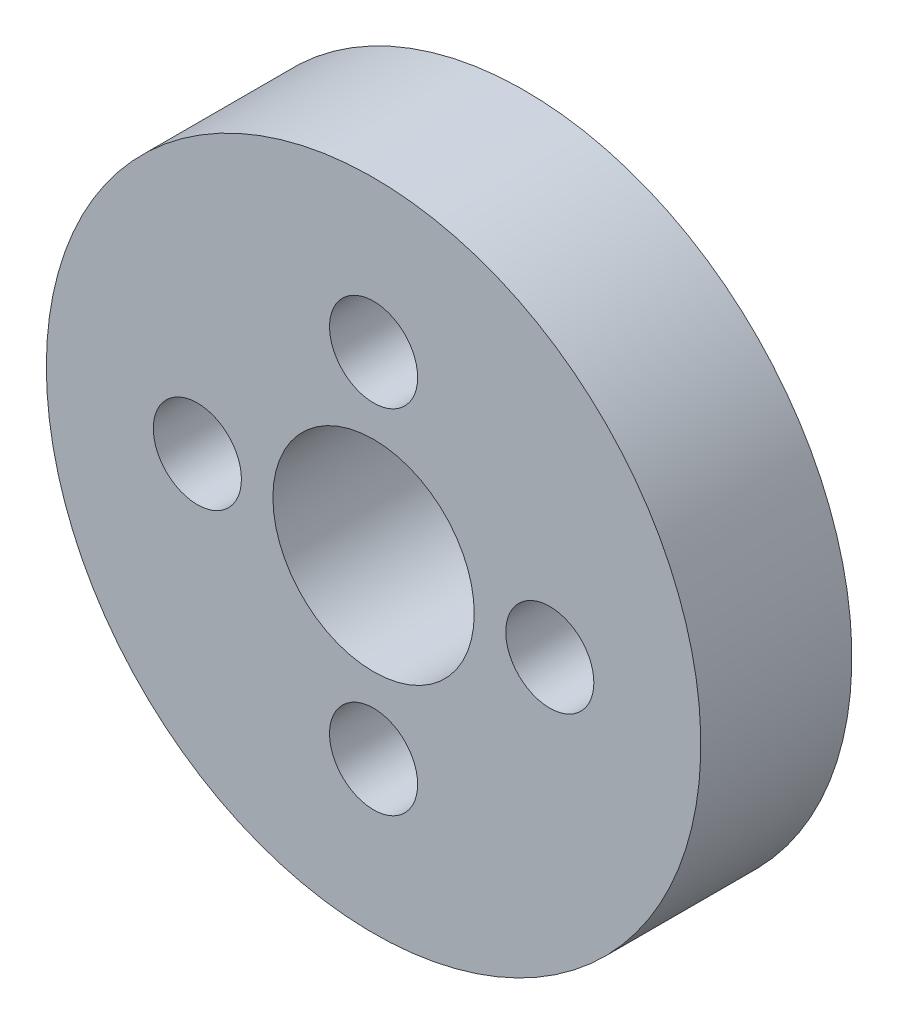
ISO-10303-21;
HEADER;
FILE_DESCRIPTION(('STEP AP214'),'2;1');
FILE_NAME('part.step','',(''),(''),'','','');
FILE_SCHEMA(('AUTOMOTIVE_DESIGN { 1 0 10303 214 1 1 1 1 }'));
ENDSEC;
DATA;
#1=APPLICATION_CONTEXT('core data for automotive mechanical design processes');
#2=APPLICATION_PROTOCOL_DEFINITION('international standard','automotive_design',2000,#1);
#3=PRODUCT_CONTEXT('',#1,'mechanical');
#4=PRODUCT('Part','Part','',(#3));
#5=PRODUCT_RELATED_PRODUCT_CATEGORY('part','',(#4));
#6=PRODUCT_DEFINITION_FORMATION('','',#4);
#7=PRODUCT_DEFINITION_CONTEXT('part definition',#1,'design');
#8=PRODUCT_DEFINITION('design','',#6,#7);
#9=PRODUCT_DEFINITION_SHAPE('','',#8);
#10=(LENGTH_UNIT() NAMED_UNIT(*) SI_UNIT(.MILLI.,.METRE.));
#11=(NAMED_UNIT(*) PLANE_ANGLE_UNIT() SI_UNIT($,.RADIAN.));
#12=(NAMED_UNIT(*) SI_UNIT($,.STERADIAN.) SOLID_ANGLE_UNIT());
#13=UNCERTAINTY_MEASURE_WITH_UNIT(LENGTH_MEASURE(1.E-05),#10,'distance_accuracy_value','');
#14=(GEOMETRIC_REPRESENTATION_CONTEXT(3) GLOBAL_UNCERTAINTY_ASSIGNED_CONTEXT((#13)) GLOBAL_UNIT_ASSIGNED_CONTEXT((#10,
#11,#12)) REPRESENTATION_CONTEXT('',''));
#15=CARTESIAN_POINT('',(0.,0.,0.));
#16=DIRECTION('',(0.,0.,1.));
#17=DIRECTION('',(1.,0.,0.));
#18=AXIS2_PLACEMENT_3D('',#15,#16,#17);
#19=CARTESIAN_POINT('',(0.,0.,4.7625));
#20=DIRECTION('',(0.,0.,1.));
#21=DIRECTION('',(1.,0.,0.));
#22=AXIS2_PLACEMENT_3D('',#19,#20,#21);
#23=PLANE('',#22);
#24=CARTESIAN_POINT('',(-5.55624999999984,-1.57918123022682E-13,4.7625));
#25=DIRECTION('',(0.,0.,1.));
#26=DIRECTION('',(1.,0.,0.));
#27=AXIS2_PLACEMENT_3D('',#24,#25,#26);
#28=CIRCLE('',#27,1.38906250000025);
#29=CARTESIAN_POINT('',(-4.16718749999959,-1.57918123022682E-13,4.7625));
#30=VERTEX_POINT('',#29);
#31=EDGE_CURVE('E72',#30,#30,#28,.T.);
#32=ORIENTED_EDGE('',*,*,#31,.F.);
#33=EDGE_LOOP('',(#32));
#34=FACE_BOUND('',#33,.T.);
#35=CARTESIAN_POINT('',(3.14475357289812E-13,-5.55625,4.7625));
#36=DIRECTION('',(0.,0.,1.));
#37=DIRECTION('',(1.,0.,0.));
#38=AXIS2_PLACEMENT_3D('',#35,#36,#37);
#39=CIRCLE('',#38,1.38906250000034);
#40=CARTESIAN_POINT('',(1.38906250000065,-5.55625,4.7625));
#41=VERTEX_POINT('',#40);
#42=EDGE_CURVE('E66',#41,#41,#39,.T.);
#43=ORIENTED_EDGE('',*,*,#42,.F.);
#44=EDGE_LOOP('',(#43));
#45=FACE_BOUND('',#44,.T.);
#46=CARTESIAN_POINT('',(5.55625000000016,1.57237678644906E-13,4.7625));
#47=DIRECTION('',(0.,0.,1.));
#48=DIRECTION('',(1.,0.,0.));
#49=AXIS2_PLACEMENT_3D('',#46,#47,#48);
#50=CIRCLE('',#49,1.38906250000012);
#51=CARTESIAN_POINT('',(6.94531250000028,1.57237678644906E-13,4.7625));
#52=VERTEX_POINT('',#51);
#53=EDGE_CURVE('E60',#52,#52,#50,.T.);
#54=ORIENTED_EDGE('',*,*,#53,.F.);
#55=EDGE_LOOP('',(#54));
#56=FACE_BOUND('',#55,.T.);
#57=CARTESIAN_POINT('',(0.,5.55625,4.7625));
#58=DIRECTION('',(0.,0.,1.));
#59=DIRECTION('',(1.,0.,0.));
#60=AXIS2_PLACEMENT_3D('',#57,#58,#59);
#61=CIRCLE('',#60,1.3890625);
#62=CARTESIAN_POINT('',(1.3890625,5.55625,4.7625));
#63=VERTEX_POINT('',#62);
#64=EDGE_CURVE('E54',#63,#63,#61,.T.);
#65=ORIENTED_EDGE('',*,*,#64,.F.);
#66=EDGE_LOOP('',(#65));
#67=FACE_BOUND('',#66,.T.);
#68=CARTESIAN_POINT('',(0.,0.,4.7625));
#69=DIRECTION('',(0.,0.,1.));
#70=DIRECTION('',(1.,0.,0.));
#71=AXIS2_PLACEMENT_3D('',#68,#69,#70);
#72=CIRCLE('',#71,10.31875);
#73=CARTESIAN_POINT('',(-10.31875,0.,4.7625));
#74=VERTEX_POINT('',#73);
#75=EDGE_CURVE('E10',#74,#74,#72,.T.);
#76=ORIENTED_EDGE('',*,*,#75,.T.);
#77=EDGE_LOOP('',(#76));
#78=FACE_BOUND('',#77,.T.);
#79=CARTESIAN_POINT('',(0.,0.,4.7625));
#80=DIRECTION('',(0.,0.,1.));
#81=DIRECTION('',(1.,0.,0.));
#82=AXIS2_PLACEMENT_3D('',#79,#80,#81);
#83=CIRCLE('',#82,3.175);
#84=CARTESIAN_POINT('',(-3.175,0.,4.7625));
#85=VERTEX_POINT('',#84);
#86=EDGE_CURVE('E46',#85,#85,#83,.T.);
#87=ORIENTED_EDGE('',*,*,#86,.F.);
#88=EDGE_LOOP('',(#87));
#89=FACE_BOUND('',#88,.T.);
#90=ADVANCED_FACE('F35',(#34,#45,#56,#67,#78,#89),#23,.T.);
#91=CARTESIAN_POINT('',(0.,0.,0.));
#92=DIRECTION('',(0.,0.,1.));
#93=DIRECTION('',(1.,0.,0.));
#94=AXIS2_PLACEMENT_3D('',#91,#92,#93);
#95=PLANE('',#94);
#96=CARTESIAN_POINT('',(-5.55624999999984,-1.57918123022682E-13,0.));
#97=DIRECTION('',(0.,0.,1.));
#98=DIRECTION('',(1.,0.,0.));
#99=AXIS2_PLACEMENT_3D('',#96,#97,#98);
#100=CIRCLE('',#99,1.38906250000025);
#101=CARTESIAN_POINT('',(-4.16718749999959,-1.57918123022682E-13,0.));
#102=VERTEX_POINT('',#101);
#103=EDGE_CURVE('E69',#102,#102,#100,.T.);
#104=ORIENTED_EDGE('',*,*,#103,.T.);
#105=EDGE_LOOP('',(#104));
#106=FACE_BOUND('',#105,.T.);
#107=CARTESIAN_POINT('',(3.14475357289812E-13,-5.55625,0.));
#108=DIRECTION('',(0.,0.,1.));
#109=DIRECTION('',(1.,0.,0.));
#110=AXIS2_PLACEMENT_3D('',#107,#108,#109);
#111=CIRCLE('',#110,1.38906250000034);
#112=CARTESIAN_POINT('',(1.38906250000065,-5.55625,0.));
#113=VERTEX_POINT('',#112);
#114=EDGE_CURVE('E63',#113,#113,#111,.T.);
#115=ORIENTED_EDGE('',*,*,#114,.T.);
#116=EDGE_LOOP('',(#115));
#117=FACE_BOUND('',#116,.T.);
#118=CARTESIAN_POINT('',(5.55625000000016,1.57237678644906E-13,0.));
#119=DIRECTION('',(0.,0.,1.));
#120=DIRECTION('',(1.,0.,0.));
#121=AXIS2_PLACEMENT_3D('',#118,#119,#120);
#122=CIRCLE('',#121,1.38906250000012);
#123=CARTESIAN_POINT('',(6.94531250000028,1.57237678644906E-13,0.));
#124=VERTEX_POINT('',#123);
#125=EDGE_CURVE('E57',#124,#124,#122,.T.);
#126=ORIENTED_EDGE('',*,*,#125,.T.);
#127=EDGE_LOOP('',(#126));
#128=FACE_BOUND('',#127,.T.);
#129=CARTESIAN_POINT('',(0.,5.55625,0.));
#130=DIRECTION('',(0.,0.,1.));
#131=DIRECTION('',(1.,0.,0.));
#132=AXIS2_PLACEMENT_3D('',#129,#130,#131);
#133=CIRCLE('',#132,1.3890625);
#134=CARTESIAN_POINT('',(1.3890625,5.55625,0.));
#135=VERTEX_POINT('',#134);
#136=EDGE_CURVE('E51',#135,#135,#133,.T.);
#137=ORIENTED_EDGE('',*,*,#136,.T.);
#138=EDGE_LOOP('',(#137));
#139=FACE_BOUND('',#138,.T.);
#140=CARTESIAN_POINT('',(0.,0.,0.));
#141=DIRECTION('',(0.,0.,1.));
#142=DIRECTION('',(1.,0.,0.));
#143=AXIS2_PLACEMENT_3D('',#140,#141,#142);
#144=CIRCLE('',#143,10.31875);
#145=CARTESIAN_POINT('',(-10.31875,0.,0.));
#146=VERTEX_POINT('',#145);
#147=EDGE_CURVE('E39',#146,#146,#144,.T.);
#148=ORIENTED_EDGE('',*,*,#147,.F.);
#149=EDGE_LOOP('',(#148));
#150=FACE_BOUND('',#149,.T.);
#151=CARTESIAN_POINT('',(0.,0.,0.));
#152=DIRECTION('',(0.,0.,1.));
#153=DIRECTION('',(1.,0.,0.));
#154=AXIS2_PLACEMENT_3D('',#151,#152,#153);
#155=CIRCLE('',#154,3.175);
#156=CARTESIAN_POINT('',(-3.175,0.,0.));
#157=VERTEX_POINT('',#156);
#158=EDGE_CURVE('E48',#157,#157,#155,.T.);
#159=ORIENTED_EDGE('',*,*,#158,.T.);
#160=EDGE_LOOP('',(#159));
#161=FACE_BOUND('',#160,.T.);
#162=ADVANCED_FACE('F78',(#106,#117,#128,#139,#150,#161),#95,.F.);
#163=CARTESIAN_POINT('',(0.,0.,4.7625));
#164=DIRECTION('',(0.,0.,-1.));
#165=DIRECTION('',(-1.,0.,0.));
#166=AXIS2_PLACEMENT_3D('',#163,#164,#165);
#167=CYLINDRICAL_SURFACE('',#166,10.31875);
#168=CARTESIAN_POINT('',(-10.31875,0.,4.7625));
#169=CARTESIAN_POINT('',(-10.31875,0.,4.712890625));
#170=CARTESIAN_POINT('',(-10.31875,0.,4.66328125));
#171=CARTESIAN_POINT('',(-10.31875,0.,4.5640625));
#172=CARTESIAN_POINT('',(-10.31875,0.,4.514453125));
#173=CARTESIAN_POINT('',(-10.31875,0.,4.415234375));
#174=CARTESIAN_POINT('',(-10.31875,0.,4.365625));
#175=CARTESIAN_POINT('',(-10.31875,0.,4.26640625));
#176=CARTESIAN_POINT('',(-10.31875,0.,4.216796875));
#177=CARTESIAN_POINT('',(-10.31875,0.,4.117578125));
#178=CARTESIAN_POINT('',(-10.31875,0.,4.06796875));
#179=CARTESIAN_POINT('',(-10.31875,0.,3.96875));
#180=CARTESIAN_POINT('',(-10.31875,0.,3.919140625));
#181=CARTESIAN_POINT('',(-10.31875,0.,3.819921875));
#182=CARTESIAN_POINT('',(-10.31875,0.,3.7703125));
#183=CARTESIAN_POINT('',(-10.31875,0.,3.67109375));
#184=CARTESIAN_POINT('',(-10.31875,0.,3.621484375));
#185=CARTESIAN_POINT('',(-10.31875,0.,3.522265625));
#186=CARTESIAN_POINT('',(-10.31875,0.,3.47265625));
#187=CARTESIAN_POINT('',(-10.31875,0.,3.3734375));
#188=CARTESIAN_POINT('',(-10.31875,0.,3.323828125));
#189=CARTESIAN_POINT('',(-10.31875,0.,3.224609375));
#190=CARTESIAN_POINT('',(-10.31875,0.,3.175));
#191=CARTESIAN_POINT('',(-10.31875,0.,3.07578125));
#192=CARTESIAN_POINT('',(-10.31875,0.,3.026171875));
#193=CARTESIAN_POINT('',(-10.31875,0.,2.926953125));
#194=CARTESIAN_POINT('',(-10.31875,0.,2.87734375));
#195=CARTESIAN_POINT('',(-10.31875,0.,2.778125));
#196=CARTESIAN_POINT('',(-10.31875,0.,2.728515625));
#197=CARTESIAN_POINT('',(-10.31875,0.,2.629296875));
#198=CARTESIAN_POINT('',(-10.31875,0.,2.5796875));
#199=CARTESIAN_POINT('',(-10.31875,0.,2.48046875));
#200=CARTESIAN_POINT('',(-10.31875,0.,2.430859375));
#201=CARTESIAN_POINT('',(-10.31875,0.,2.331640625));
#202=CARTESIAN_POINT('',(-10.31875,0.,2.28203125));
#203=CARTESIAN_POINT('',(-10.31875,0.,2.1828125));
#204=CARTESIAN_POINT('',(-10.31875,0.,2.133203125));
#205=CARTESIAN_POINT('',(-10.31875,0.,2.033984375));
#206=CARTESIAN_POINT('',(-10.31875,0.,1.984375));
#207=CARTESIAN_POINT('',(-10.31875,0.,1.88515625));
#208=CARTESIAN_POINT('',(-10.31875,0.,1.835546875));
#209=CARTESIAN_POINT('',(-10.31875,0.,1.736328125));
#210=CARTESIAN_POINT('',(-10.31875,0.,1.68671875));
#211=CARTESIAN_POINT('',(-10.31875,0.,1.5875));
#212=CARTESIAN_POINT('',(-10.31875,0.,1.537890625));
#213=CARTESIAN_POINT('',(-10.31875,0.,1.438671875));
#214=CARTESIAN_POINT('',(-10.31875,0.,1.3890625));
#215=CARTESIAN_POINT('',(-10.31875,0.,1.28984375));
#216=CARTESIAN_POINT('',(-10.31875,0.,1.240234375));
#217=CARTESIAN_POINT('',(-10.31875,0.,1.141015625));
#218=CARTESIAN_POINT('',(-10.31875,0.,1.09140625));
#219=CARTESIAN_POINT('',(-10.31875,0.,0.9921875));
#220=CARTESIAN_POINT('',(-10.31875,0.,0.942578125));
#221=CARTESIAN_POINT('',(-10.31875,0.,0.843359375));
#222=CARTESIAN_POINT('',(-10.31875,0.,0.79375));
#223=CARTESIAN_POINT('',(-10.31875,0.,0.69453125));
#224=CARTESIAN_POINT('',(-10.31875,0.,0.644921875));
#225=CARTESIAN_POINT('',(-10.31875,0.,0.545703125));
#226=CARTESIAN_POINT('',(-10.31875,0.,0.49609375));
#227=CARTESIAN_POINT('',(-10.31875,0.,0.396875));
#228=CARTESIAN_POINT('',(-10.31875,0.,0.347265625));
#229=CARTESIAN_POINT('',(-10.31875,0.,0.248046875));
#230=CARTESIAN_POINT('',(-10.31875,0.,0.1984375));
#231=CARTESIAN_POINT('',(-10.31875,0.,0.09921875));
#232=CARTESIAN_POINT('',(-10.31875,0.,0.049609375));
#233=CARTESIAN_POINT('',(-10.31875,0.,0.));
#234=B_SPLINE_CURVE_WITH_KNOTS('',3,(#168,#169,#170,#171,#172,#173,#174,#175,#176,#177,#178,
#179,#180,#181,#182,#183,#184,#185,#186,#187,#188,#189,#190,#191,#192,#193,#194,#195,#196,#197,
#198,#199,#200,#201,#202,#203,#204,#205,#206,#207,#208,#209,#210,#211,#212,#213,#214,#215,#216,
#217,#218,#219,#220,#221,#222,#223,#224,#225,#226,#227,#228,#229,#230,#231,#232,#233),
.UNSPECIFIED.,.F.,.F.,(4,2,2,2,2,2,2,2,2,2,2,2,2,2,2,2,2,2,2,2,2,2,2,2,2,2,2,2,2,2,2,2,4),(0.,
0.148828124999999,0.297656249999999,0.446484374999999,0.595312499999999,0.744140625,0.89296875,
1.041796875,1.190625,1.339453125,1.48828125,1.637109375,1.7859375,1.934765625,2.08359375,
2.232421875,2.38125,2.530078125,2.67890625,2.827734375,2.9765625,3.125390625,3.27421875,
3.423046875,3.571875,3.720703125,3.86953125,4.018359375,4.1671875,4.316015625,4.46484375,
4.613671875,4.7625),.UNSPECIFIED.);
#235=EDGE_CURVE('BSEAM37',#74,#146,#234,.T.);
#236=ORIENTED_EDGE('',*,*,#75,.F.);
#237=ORIENTED_EDGE('',*,*,#147,.T.);
#238=ORIENTED_EDGE('',*,*,#235,.T.);
#239=ORIENTED_EDGE('',*,*,#235,.F.);
#240=EDGE_LOOP('',(#236,#238,#237,#239));
#241=FACE_BOUND('',#240,.T.);
#242=ADVANCED_FACE('F37',(#241),#167,.T.);
#243=CARTESIAN_POINT('',(0.,0.,4.7625));
#244=DIRECTION('',(0.,0.,-1.));
#245=DIRECTION('',(-1.,0.,0.));
#246=AXIS2_PLACEMENT_3D('',#243,#244,#245);
#247=CYLINDRICAL_SURFACE('',#246,3.175);
#248=CARTESIAN_POINT('',(-3.175,0.,4.7625));
#249=CARTESIAN_POINT('',(-3.175,0.,4.712890625));
#250=CARTESIAN_POINT('',(-3.175,0.,4.66328125));
#251=CARTESIAN_POINT('',(-3.175,0.,4.5640625));
#252=CARTESIAN_POINT('',(-3.175,0.,4.514453125));
#253=CARTESIAN_POINT('',(-3.175,0.,4.415234375));
#254=CARTESIAN_POINT('',(-3.175,0.,4.365625));
#255=CARTESIAN_POINT('',(-3.175,0.,4.26640625));
#256=CARTESIAN_POINT('',(-3.175,0.,4.216796875));
#257=CARTESIAN_POINT('',(-3.175,0.,4.117578125));
#258=CARTESIAN_POINT('',(-3.175,0.,4.06796875));
#259=CARTESIAN_POINT('',(-3.175,0.,3.96875));
#260=CARTESIAN_POINT('',(-3.175,0.,3.919140625));
#261=CARTESIAN_POINT('',(-3.175,0.,3.819921875));
#262=CARTESIAN_POINT('',(-3.175,0.,3.7703125));
#263=CARTESIAN_POINT('',(-3.175,0.,3.67109375));
#264=CARTESIAN_POINT('',(-3.175,0.,3.621484375));
#265=CARTESIAN_POINT('',(-3.175,0.,3.522265625));
#266=CARTESIAN_POINT('',(-3.175,0.,3.47265625));
#267=CARTESIAN_POINT('',(-3.175,0.,3.3734375));
#268=CARTESIAN_POINT('',(-3.175,0.,3.323828125));
#269=CARTESIAN_POINT('',(-3.175,0.,3.224609375));
#270=CARTESIAN_POINT('',(-3.175,0.,3.175));
#271=CARTESIAN_POINT('',(-3.175,0.,3.07578125));
#272=CARTESIAN_POINT('',(-3.175,0.,3.026171875));
#273=CARTESIAN_POINT('',(-3.175,0.,2.926953125));
#274=CARTESIAN_POINT('',(-3.175,0.,2.87734375));
#275=CARTESIAN_POINT('',(-3.175,0.,2.778125));
#276=CARTESIAN_POINT('',(-3.175,0.,2.728515625));
#277=CARTESIAN_POINT('',(-3.175,0.,2.629296875));
#278=CARTESIAN_POINT('',(-3.175,0.,2.5796875));
#279=CARTESIAN_POINT('',(-3.175,0.,2.48046875));
#280=CARTESIAN_POINT('',(-3.175,0.,2.430859375));
#281=CARTESIAN_POINT('',(-3.175,0.,2.331640625));
#282=CARTESIAN_POINT('',(-3.175,0.,2.28203125));
#283=CARTESIAN_POINT('',(-3.175,0.,2.1828125));
#284=CARTESIAN_POINT('',(-3.175,0.,2.133203125));
#285=CARTESIAN_POINT('',(-3.175,0.,2.033984375));
#286=CARTESIAN_POINT('',(-3.175,0.,1.984375));
#287=CARTESIAN_POINT('',(-3.175,0.,1.88515625));
#288=CARTESIAN_POINT('',(-3.175,0.,1.835546875));
#289=CARTESIAN_POINT('',(-3.175,0.,1.736328125));
#290=CARTESIAN_POINT('',(-3.175,0.,1.68671875));
#291=CARTESIAN_POINT('',(-3.175,0.,1.5875));
#292=CARTESIAN_POINT('',(-3.175,0.,1.537890625));
#293=CARTESIAN_POINT('',(-3.175,0.,1.438671875));
#294=CARTESIAN_POINT('',(-3.175,0.,1.3890625));
#295=CARTESIAN_POINT('',(-3.175,0.,1.28984375));
#296=CARTESIAN_POINT('',(-3.175,0.,1.240234375));
#297=CARTESIAN_POINT('',(-3.175,0.,1.141015625));
#298=CARTESIAN_POINT('',(-3.175,0.,1.09140625));
#299=CARTESIAN_POINT('',(-3.175,0.,0.9921875));
#300=CARTESIAN_POINT('',(-3.175,0.,0.942578125));
#301=CARTESIAN_POINT('',(-3.175,0.,0.843359375));
#302=CARTESIAN_POINT('',(-3.175,0.,0.79375));
#303=CARTESIAN_POINT('',(-3.175,0.,0.69453125));
#304=CARTESIAN_POINT('',(-3.175,0.,0.644921875));
#305=CARTESIAN_POINT('',(-3.175,0.,0.545703125));
#306=CARTESIAN_POINT('',(-3.175,0.,0.49609375));
#307=CARTESIAN_POINT('',(-3.175,0.,0.396875));
#308=CARTESIAN_POINT('',(-3.175,0.,0.347265625));
#309=CARTESIAN_POINT('',(-3.175,0.,0.248046875));
#310=CARTESIAN_POINT('',(-3.175,0.,0.1984375));
#311=CARTESIAN_POINT('',(-3.175,0.,0.09921875));
#312=CARTESIAN_POINT('',(-3.175,0.,0.049609375));
#313=CARTESIAN_POINT('',(-3.175,0.,0.));
#314=B_SPLINE_CURVE_WITH_KNOTS('',3,(#248,#249,#250,#251,#252,#253,#254,#255,#256,#257,#258,
#259,#260,#261,#262,#263,#264,#265,#266,#267,#268,#269,#270,#271,#272,#273,#274,#275,#276,#277,
#278,#279,#280,#281,#282,#283,#284,#285,#286,#287,#288,#289,#290,#291,#292,#293,#294,#295,#296,
#297,#298,#299,#300,#301,#302,#303,#304,#305,#306,#307,#308,#309,#310,#311,#312,#313),
.UNSPECIFIED.,.F.,.F.,(4,2,2,2,2,2,2,2,2,2,2,2,2,2,2,2,2,2,2,2,2,2,2,2,2,2,2,2,2,2,2,2,4),(0.,
0.148828124999999,0.297656249999999,0.446484374999999,0.595312499999999,0.744140625,0.89296875,
1.041796875,1.190625,1.339453125,1.48828125,1.637109375,1.7859375,1.934765625,2.08359375,
2.232421875,2.38125,2.530078125,2.67890625,2.827734375,2.9765625,3.125390625,3.27421875,
3.423046875,3.571875,3.720703125,3.86953125,4.018359375,4.1671875,4.316015625,4.46484375,
4.613671875,4.7625),.UNSPECIFIED.);
#315=EDGE_CURVE('BSEAM99',#85,#157,#314,.T.);
#316=ORIENTED_EDGE('',*,*,#86,.T.);
#317=ORIENTED_EDGE('',*,*,#158,.F.);
#318=ORIENTED_EDGE('',*,*,#315,.T.);
#319=ORIENTED_EDGE('',*,*,#315,.F.);
#320=EDGE_LOOP('',(#316,#318,#317,#319));
#321=FACE_BOUND('',#320,.T.);
#322=ADVANCED_FACE('F99',(#321),#247,.F.);
#323=CARTESIAN_POINT('',(0.,5.55625,0.));
#324=DIRECTION('',(0.,0.,1.));
#325=DIRECTION('',(1.,0.,0.));
#326=AXIS2_PLACEMENT_3D('',#323,#324,#325);
#327=CYLINDRICAL_SURFACE('',#326,1.3890625);
#328=CARTESIAN_POINT('',(1.3890625,5.55625,0.));
#329=CARTESIAN_POINT('',(1.3890625,5.55625,0.049609375));
#330=CARTESIAN_POINT('',(1.3890625,5.55625,0.09921875));
#331=CARTESIAN_POINT('',(1.3890625,5.55625,0.1984375));
#332=CARTESIAN_POINT('',(1.3890625,5.55625,0.248046875));
#333=CARTESIAN_POINT('',(1.3890625,5.55625,0.347265625));
#334=CARTESIAN_POINT('',(1.3890625,5.55625,0.396875));
#335=CARTESIAN_POINT('',(1.3890625,5.55625,0.49609375));
#336=CARTESIAN_POINT('',(1.3890625,5.55625,0.545703125));
#337=CARTESIAN_POINT('',(1.3890625,5.55625,0.644921875));
#338=CARTESIAN_POINT('',(1.3890625,5.55625,0.69453125));
#339=CARTESIAN_POINT('',(1.3890625,5.55625,0.79375));
#340=CARTESIAN_POINT('',(1.3890625,5.55625,0.843359375));
#341=CARTESIAN_POINT('',(1.3890625,5.55625,0.942578125));
#342=CARTESIAN_POINT('',(1.3890625,5.55625,0.9921875));
#343=CARTESIAN_POINT('',(1.3890625,5.55625,1.09140625));
#344=CARTESIAN_POINT('',(1.3890625,5.55625,1.141015625));
#345=CARTESIAN_POINT('',(1.3890625,5.55625,1.240234375));
#346=CARTESIAN_POINT('',(1.3890625,5.55625,1.28984375));
#347=CARTESIAN_POINT('',(1.3890625,5.55625,1.3890625));
#348=CARTESIAN_POINT('',(1.3890625,5.55625,1.438671875));
#349=CARTESIAN_POINT('',(1.3890625,5.55625,1.537890625));
#350=CARTESIAN_POINT('',(1.3890625,5.55625,1.5875));
#351=CARTESIAN_POINT('',(1.3890625,5.55625,1.68671875));
#352=CARTESIAN_POINT('',(1.3890625,5.55625,1.736328125));
#353=CARTESIAN_POINT('',(1.3890625,5.55625,1.835546875));
#354=CARTESIAN_POINT('',(1.3890625,5.55625,1.88515625));
#355=CARTESIAN_POINT('',(1.3890625,5.55625,1.984375));
#356=CARTESIAN_POINT('',(1.3890625,5.55625,2.033984375));
#357=CARTESIAN_POINT('',(1.3890625,5.55625,2.133203125));
#358=CARTESIAN_POINT('',(1.3890625,5.55625,2.1828125));
#359=CARTESIAN_POINT('',(1.3890625,5.55625,2.28203125));
#360=CARTESIAN_POINT('',(1.3890625,5.55625,2.331640625));
#361=CARTESIAN_POINT('',(1.3890625,5.55625,2.430859375));
#362=CARTESIAN_POINT('',(1.3890625,5.55625,2.48046875));
#363=CARTESIAN_POINT('',(1.3890625,5.55625,2.5796875));
#364=CARTESIAN_POINT('',(1.3890625,5.55625,2.629296875));
#365=CARTESIAN_POINT('',(1.3890625,5.55625,2.728515625));
#366=CARTESIAN_POINT('',(1.3890625,5.55625,2.778125));
#367=CARTESIAN_POINT('',(1.3890625,5.55625,2.87734375));
#368=CARTESIAN_POINT('',(1.3890625,5.55625,2.926953125));
#369=CARTESIAN_POINT('',(1.3890625,5.55625,3.026171875));
#370=CARTESIAN_POINT('',(1.3890625,5.55625,3.07578125));
#371=CARTESIAN_POINT('',(1.3890625,5.55625,3.175));
#372=CARTESIAN_POINT('',(1.3890625,5.55625,3.224609375));
#373=CARTESIAN_POINT('',(1.3890625,5.55625,3.323828125));
#374=CARTESIAN_POINT('',(1.3890625,5.55625,3.3734375));
#375=CARTESIAN_POINT('',(1.3890625,5.55625,3.47265625));
#376=CARTESIAN_POINT('',(1.3890625,5.55625,3.522265625));
#377=CARTESIAN_POINT('',(1.3890625,5.55625,3.621484375));
#378=CARTESIAN_POINT('',(1.3890625,5.55625,3.67109375));
#379=CARTESIAN_POINT('',(1.3890625,5.55625,3.7703125));
#380=CARTESIAN_POINT('',(1.3890625,5.55625,3.819921875));
#381=CARTESIAN_POINT('',(1.3890625,5.55625,3.919140625));
#382=CARTESIAN_POINT('',(1.3890625,5.55625,3.96875));
#383=CARTESIAN_POINT('',(1.3890625,5.55625,4.06796875));
#384=CARTESIAN_POINT('',(1.3890625,5.55625,4.117578125));
#385=CARTESIAN_POINT('',(1.3890625,5.55625,4.216796875));
#386=CARTESIAN_POINT('',(1.3890625,5.55625,4.26640625));
#387=CARTESIAN_POINT('',(1.3890625,5.55625,4.365625));
#388=CARTESIAN_POINT('',(1.3890625,5.55625,4.415234375));
#389=CARTESIAN_POINT('',(1.3890625,5.55625,4.514453125));
#390=CARTESIAN_POINT('',(1.3890625,5.55625,4.5640625));
#391=CARTESIAN_POINT('',(1.3890625,5.55625,4.66328125));
#392=CARTESIAN_POINT('',(1.3890625,5.55625,4.712890625));
#393=CARTESIAN_POINT('',(1.3890625,5.55625,4.7625));
#394=B_SPLINE_CURVE_WITH_KNOTS('',3,(#328,#329,#330,#331,#332,#333,#334,#335,#336,#337,#338,
#339,#340,#341,#342,#343,#344,#345,#346,#347,#348,#349,#350,#351,#352,#353,#354,#355,#356,#357,
#358,#359,#360,#361,#362,#363,#364,#365,#366,#367,#368,#369,#370,#371,#372,#373,#374,#375,#376,
#377,#378,#379,#380,#381,#382,#383,#384,#385,#386,#387,#388,#389,#390,#391,#392,#393),
.UNSPECIFIED.,.F.,.F.,(4,2,2,2,2,2,2,2,2,2,2,2,2,2,2,2,2,2,2,2,2,2,2,2,2,2,2,2,2,2,2,2,4),(0.,
0.148828125,0.29765625,0.446484375,0.5953125,0.744140625,0.89296875,1.041796875,1.190625,
1.339453125,1.48828125,1.637109375,1.7859375,1.934765625,2.08359375,2.232421875,2.38125,
2.530078125,2.67890625,2.827734375,2.9765625,3.125390625,3.27421875,3.423046875,3.571875,
3.720703125,3.86953125,4.018359375,4.1671875,4.316015625,4.46484375,4.613671875,4.7625),.UNSPECIFIED.);
#395=EDGE_CURVE('BSEAM102',#135,#63,#394,.T.);
#396=ORIENTED_EDGE('',*,*,#136,.F.);
#397=ORIENTED_EDGE('',*,*,#64,.T.);
#398=ORIENTED_EDGE('',*,*,#395,.T.);
#399=ORIENTED_EDGE('',*,*,#395,.F.);
#400=EDGE_LOOP('',(#396,#398,#397,#399));
#401=FACE_BOUND('',#400,.T.);
#402=ADVANCED_FACE('F102',(#401),#327,.F.);
#403=CARTESIAN_POINT('',(5.55625000000016,1.57237678644906E-13,0.));
#404=DIRECTION('',(0.,0.,1.));
#405=DIRECTION('',(1.,0.,0.));
#406=AXIS2_PLACEMENT_3D('',#403,#404,#405);
#407=CYLINDRICAL_SURFACE('',#406,1.38906250000012);
#408=CARTESIAN_POINT('',(6.94531250000028,1.57237678644906E-13,0.));
#409=CARTESIAN_POINT('',(6.94531250000028,1.57237678644906E-13,0.049609375));
#410=CARTESIAN_POINT('',(6.94531250000028,1.57237678644906E-13,0.09921875));
#411=CARTESIAN_POINT('',(6.94531250000028,1.57237678644906E-13,0.1984375));
#412=CARTESIAN_POINT('',(6.94531250000028,1.57237678644906E-13,0.248046875));
#413=CARTESIAN_POINT('',(6.94531250000028,1.57237678644906E-13,0.347265625));
#414=CARTESIAN_POINT('',(6.94531250000028,1.57237678644906E-13,0.396875));
#415=CARTESIAN_POINT('',(6.94531250000028,1.57237678644906E-13,0.49609375));
#416=CARTESIAN_POINT('',(6.94531250000028,1.57237678644906E-13,0.545703125));
#417=CARTESIAN_POINT('',(6.94531250000028,1.57237678644906E-13,0.644921875));
#418=CARTESIAN_POINT('',(6.94531250000028,1.57237678644906E-13,0.69453125));
#419=CARTESIAN_POINT('',(6.94531250000028,1.57237678644906E-13,0.79375));
#420=CARTESIAN_POINT('',(6.94531250000028,1.57237678644906E-13,0.843359375));
#421=CARTESIAN_POINT('',(6.94531250000028,1.57237678644906E-13,0.942578125));
#422=CARTESIAN_POINT('',(6.94531250000028,1.57237678644906E-13,0.9921875));
#423=CARTESIAN_POINT('',(6.94531250000028,1.57237678644906E-13,1.09140625));
#424=CARTESIAN_POINT('',(6.94531250000028,1.57237678644906E-13,1.141015625));
#425=CARTESIAN_POINT('',(6.94531250000028,1.57237678644906E-13,1.240234375));
#426=CARTESIAN_POINT('',(6.94531250000028,1.57237678644906E-13,1.28984375));
#427=CARTESIAN_POINT('',(6.94531250000028,1.57237678644906E-13,1.3890625));
#428=CARTESIAN_POINT('',(6.94531250000028,1.57237678644906E-13,1.438671875));
#429=CARTESIAN_POINT('',(6.94531250000028,1.57237678644906E-13,1.537890625));
#430=CARTESIAN_POINT('',(6.94531250000028,1.57237678644906E-13,1.5875));
#431=CARTESIAN_POINT('',(6.94531250000028,1.57237678644906E-13,1.68671875));
#432=CARTESIAN_POINT('',(6.94531250000028,1.57237678644906E-13,1.736328125));
#433=CARTESIAN_POINT('',(6.94531250000028,1.57237678644906E-13,1.835546875));
#434=CARTESIAN_POINT('',(6.94531250000028,1.57237678644906E-13,1.88515625));
#435=CARTESIAN_POINT('',(6.94531250000028,1.57237678644906E-13,1.984375));
#436=CARTESIAN_POINT('',(6.94531250000028,1.57237678644906E-13,2.033984375));
#437=CARTESIAN_POINT('',(6.94531250000028,1.57237678644906E-13,2.133203125));
#438=CARTESIAN_POINT('',(6.94531250000028,1.57237678644906E-13,2.1828125));
#439=CARTESIAN_POINT('',(6.94531250000028,1.57237678644906E-13,2.28203125));
#440=CARTESIAN_POINT('',(6.94531250000028,1.57237678644906E-13,2.331640625));
#441=CARTESIAN_POINT('',(6.94531250000028,1.57237678644906E-13,2.430859375));
#442=CARTESIAN_POINT('',(6.94531250000028,1.57237678644906E-13,2.48046875));
#443=CARTESIAN_POINT('',(6.94531250000028,1.57237678644906E-13,2.5796875));
#444=CARTESIAN_POINT('',(6.94531250000028,1.57237678644906E-13,2.629296875));
#445=CARTESIAN_POINT('',(6.94531250000028,1.57237678644906E-13,2.728515625));
#446=CARTESIAN_POINT('',(6.94531250000028,1.57237678644906E-13,2.778125));
#447=CARTESIAN_POINT('',(6.94531250000028,1.57237678644906E-13,2.87734375));
#448=CARTESIAN_POINT('',(6.94531250000028,1.57237678644906E-13,2.926953125));
#449=CARTESIAN_POINT('',(6.94531250000028,1.57237678644906E-13,3.026171875));
#450=CARTESIAN_POINT('',(6.94531250000028,1.57237678644906E-13,3.07578125));
#451=CARTESIAN_POINT('',(6.94531250000028,1.57237678644906E-13,3.175));
#452=CARTESIAN_POINT('',(6.94531250000028,1.57237678644906E-13,3.224609375));
#453=CARTESIAN_POINT('',(6.94531250000028,1.57237678644906E-13,3.323828125));
#454=CARTESIAN_POINT('',(6.94531250000028,1.57237678644906E-13,3.3734375));
#455=CARTESIAN_POINT('',(6.94531250000028,1.57237678644906E-13,3.47265625));
#456=CARTESIAN_POINT('',(6.94531250000028,1.57237678644906E-13,3.522265625));
#457=CARTESIAN_POINT('',(6.94531250000028,1.57237678644906E-13,3.621484375));
#458=CARTESIAN_POINT('',(6.94531250000028,1.57237678644906E-13,3.67109375));
#459=CARTESIAN_POINT('',(6.94531250000028,1.57237678644906E-13,3.7703125));
#460=CARTESIAN_POINT('',(6.94531250000028,1.57237678644906E-13,3.819921875));
#461=CARTESIAN_POINT('',(6.94531250000028,1.57237678644906E-13,3.919140625));
#462=CARTESIAN_POINT('',(6.94531250000028,1.57237678644906E-13,3.96875));
#463=CARTESIAN_POINT('',(6.94531250000028,1.57237678644906E-13,4.06796875));
#464=CARTESIAN_POINT('',(6.94531250000028,1.57237678644906E-13,4.117578125));
#465=CARTESIAN_POINT('',(6.94531250000028,1.57237678644906E-13,4.216796875));
#466=CARTESIAN_POINT('',(6.94531250000028,1.57237678644906E-13,4.26640625));
#467=CARTESIAN_POINT('',(6.94531250000028,1.57237678644906E-13,4.365625));
#468=CARTESIAN_POINT('',(6.94531250000028,1.57237678644906E-13,4.415234375));
#469=CARTESIAN_POINT('',(6.94531250000028,1.57237678644906E-13,4.514453125));
#470=CARTESIAN_POINT('',(6.94531250000028,1.57237678644906E-13,4.5640625));
#471=CARTESIAN_POINT('',(6.94531250000028,1.57237678644906E-13,4.66328125));
#472=CARTESIAN_POINT('',(6.94531250000028,1.57237678644906E-13,4.712890625));
#473=CARTESIAN_POINT('',(6.94531250000028,1.57237678644906E-13,4.7625));
#474=B_SPLINE_CURVE_WITH_KNOTS('',3,(#408,#409,#410,#411,#412,#413,#414,#415,#416,#417,#418,
#419,#420,#421,#422,#423,#424,#425,#426,#427,#428,#429,#430,#431,#432,#433,#434,#435,#436,#437,
#438,#439,#440,#441,#442,#443,#444,#445,#446,#447,#448,#449,#450,#451,#452,#453,#454,#455,#456,
#457,#458,#459,#460,#461,#462,#463,#464,#465,#466,#467,#468,#469,#470,#471,#472,#473),
.UNSPECIFIED.,.F.,.F.,(4,2,2,2,2,2,2,2,2,2,2,2,2,2,2,2,2,2,2,2,2,2,2,2,2,2,2,2,2,2,2,2,4),(0.,
0.148828125,0.29765625,0.446484375,0.5953125,0.744140625,0.89296875,1.041796875,1.190625,
1.339453125,1.48828125,1.637109375,1.7859375,1.934765625,2.08359375,2.232421875,2.38125,
2.530078125,2.67890625,2.827734375,2.9765625,3.125390625,3.27421875,3.423046875,3.571875,
3.720703125,3.86953125,4.018359375,4.1671875,4.316015625,4.46484375,4.613671875,4.7625),.UNSPECIFIED.);
#475=EDGE_CURVE('BSEAM114',#124,#52,#474,.T.);
#476=ORIENTED_EDGE('',*,*,#125,.F.);
#477=ORIENTED_EDGE('',*,*,#53,.T.);
#478=ORIENTED_EDGE('',*,*,#475,.T.);
#479=ORIENTED_EDGE('',*,*,#475,.F.);
#480=EDGE_LOOP('',(#476,#478,#477,#479));
#481=FACE_BOUND('',#480,.T.);
#482=ADVANCED_FACE('F114',(#481),#407,.F.);
#483=CARTESIAN_POINT('',(3.14475357289812E-13,-5.55625,0.));
#484=DIRECTION('',(0.,0.,1.));
#485=DIRECTION('',(1.,0.,0.));
#486=AXIS2_PLACEMENT_3D('',#483,#484,#485);
#487=CYLINDRICAL_SURFACE('',#486,1.38906250000034);
#488=CARTESIAN_POINT('',(1.38906250000065,-5.55625,0.));
#489=CARTESIAN_POINT('',(1.38906250000065,-5.55625,0.049609375));
#490=CARTESIAN_POINT('',(1.38906250000065,-5.55625,0.09921875));
#491=CARTESIAN_POINT('',(1.38906250000065,-5.55625,0.1984375));
#492=CARTESIAN_POINT('',(1.38906250000065,-5.55625,0.248046875));
#493=CARTESIAN_POINT('',(1.38906250000065,-5.55625,0.347265625));
#494=CARTESIAN_POINT('',(1.38906250000065,-5.55625,0.396875));
#495=CARTESIAN_POINT('',(1.38906250000065,-5.55625,0.49609375));
#496=CARTESIAN_POINT('',(1.38906250000065,-5.55625,0.545703125));
#497=CARTESIAN_POINT('',(1.38906250000065,-5.55625,0.644921875));
#498=CARTESIAN_POINT('',(1.38906250000065,-5.55625,0.69453125));
#499=CARTESIAN_POINT('',(1.38906250000065,-5.55625,0.79375));
#500=CARTESIAN_POINT('',(1.38906250000065,-5.55625,0.843359375));
#501=CARTESIAN_POINT('',(1.38906250000065,-5.55625,0.942578125));
#502=CARTESIAN_POINT('',(1.38906250000065,-5.55625,0.9921875));
#503=CARTESIAN_POINT('',(1.38906250000065,-5.55625,1.09140625));
#504=CARTESIAN_POINT('',(1.38906250000065,-5.55625,1.141015625));
#505=CARTESIAN_POINT('',(1.38906250000065,-5.55625,1.240234375));
#506=CARTESIAN_POINT('',(1.38906250000065,-5.55625,1.28984375));
#507=CARTESIAN_POINT('',(1.38906250000065,-5.55625,1.3890625));
#508=CARTESIAN_POINT('',(1.38906250000065,-5.55625,1.438671875));
#509=CARTESIAN_POINT('',(1.38906250000065,-5.55625,1.537890625));
#510=CARTESIAN_POINT('',(1.38906250000065,-5.55625,1.5875));
#511=CARTESIAN_POINT('',(1.38906250000065,-5.55625,1.68671875));
#512=CARTESIAN_POINT('',(1.38906250000065,-5.55625,1.736328125));
#513=CARTESIAN_POINT('',(1.38906250000065,-5.55625,1.835546875));
#514=CARTESIAN_POINT('',(1.38906250000065,-5.55625,1.88515625));
#515=CARTESIAN_POINT('',(1.38906250000065,-5.55625,1.984375));
#516=CARTESIAN_POINT('',(1.38906250000065,-5.55625,2.033984375));
#517=CARTESIAN_POINT('',(1.38906250000065,-5.55625,2.133203125));
#518=CARTESIAN_POINT('',(1.38906250000065,-5.55625,2.1828125));
#519=CARTESIAN_POINT('',(1.38906250000065,-5.55625,2.28203125));
#520=CARTESIAN_POINT('',(1.38906250000065,-5.55625,2.331640625));
#521=CARTESIAN_POINT('',(1.38906250000065,-5.55625,2.430859375));
#522=CARTESIAN_POINT('',(1.38906250000065,-5.55625,2.48046875));
#523=CARTESIAN_POINT('',(1.38906250000065,-5.55625,2.5796875));
#524=CARTESIAN_POINT('',(1.38906250000065,-5.55625,2.629296875));
#525=CARTESIAN_POINT('',(1.38906250000065,-5.55625,2.728515625));
#526=CARTESIAN_POINT('',(1.38906250000065,-5.55625,2.778125));
#527=CARTESIAN_POINT('',(1.38906250000065,-5.55625,2.87734375));
#528=CARTESIAN_POINT('',(1.38906250000065,-5.55625,2.926953125));
#529=CARTESIAN_POINT('',(1.38906250000065,-5.55625,3.026171875));
#530=CARTESIAN_POINT('',(1.38906250000065,-5.55625,3.07578125));
#531=CARTESIAN_POINT('',(1.38906250000065,-5.55625,3.175));
#532=CARTESIAN_POINT('',(1.38906250000065,-5.55625,3.224609375));
#533=CARTESIAN_POINT('',(1.38906250000065,-5.55625,3.323828125));
#534=CARTESIAN_POINT('',(1.38906250000065,-5.55625,3.3734375));
#535=CARTESIAN_POINT('',(1.38906250000065,-5.55625,3.47265625));
#536=CARTESIAN_POINT('',(1.38906250000065,-5.55625,3.522265625));
#537=CARTESIAN_POINT('',(1.38906250000065,-5.55625,3.621484375));
#538=CARTESIAN_POINT('',(1.38906250000065,-5.55625,3.67109375));
#539=CARTESIAN_POINT('',(1.38906250000065,-5.55625,3.7703125));
#540=CARTESIAN_POINT('',(1.38906250000065,-5.55625,3.819921875));
#541=CARTESIAN_POINT('',(1.38906250000065,-5.55625,3.919140625));
#542=CARTESIAN_POINT('',(1.38906250000065,-5.55625,3.96875));
#543=CARTESIAN_POINT('',(1.38906250000065,-5.55625,4.06796875));
#544=CARTESIAN_POINT('',(1.38906250000065,-5.55625,4.117578125));
#545=CARTESIAN_POINT('',(1.38906250000065,-5.55625,4.216796875));
#546=CARTESIAN_POINT('',(1.38906250000065,-5.55625,4.26640625));
#547=CARTESIAN_POINT('',(1.38906250000065,-5.55625,4.365625));
#548=CARTESIAN_POINT('',(1.38906250000065,-5.55625,4.415234375));
#549=CARTESIAN_POINT('',(1.38906250000065,-5.55625,4.514453125));
#550=CARTESIAN_POINT('',(1.38906250000065,-5.55625,4.5640625));
#551=CARTESIAN_POINT('',(1.38906250000065,-5.55625,4.66328125));
#552=CARTESIAN_POINT('',(1.38906250000065,-5.55625,4.712890625));
#553=CARTESIAN_POINT('',(1.38906250000065,-5.55625,4.7625));
#554=B_SPLINE_CURVE_WITH_KNOTS('',3,(#488,#489,#490,#491,#492,#493,#494,#495,#496,#497,#498,
#499,#500,#501,#502,#503,#504,#505,#506,#507,#508,#509,#510,#511,#512,#513,#514,#515,#516,#517,
#518,#519,#520,#521,#522,#523,#524,#525,#526,#527,#528,#529,#530,#531,#532,#533,#534,#535,#536,
#537,#538,#539,#540,#541,#542,#543,#544,#545,#546,#547,#548,#549,#550,#551,#552,#553),
.UNSPECIFIED.,.F.,.F.,(4,2,2,2,2,2,2,2,2,2,2,2,2,2,2,2,2,2,2,2,2,2,2,2,2,2,2,2,2,2,2,2,4),(0.,
0.148828125,0.29765625,0.446484375,0.5953125,0.744140625,0.89296875,1.041796875,1.190625,
1.339453125,1.48828125,1.637109375,1.7859375,1.934765625,2.08359375,2.232421875,2.38125,
2.530078125,2.67890625,2.827734375,2.9765625,3.125390625,3.27421875,3.423046875,3.571875,
3.720703125,3.86953125,4.018359375,4.1671875,4.316015625,4.46484375,4.613671875,4.7625),.UNSPECIFIED.);
#555=EDGE_CURVE('BSEAM84',#113,#41,#554,.T.);
#556=ORIENTED_EDGE('',*,*,#114,.F.);
#557=ORIENTED_EDGE('',*,*,#42,.T.);
#558=ORIENTED_EDGE('',*,*,#555,.T.);
#559=ORIENTED_EDGE('',*,*,#555,.F.);
#560=EDGE_LOOP('',(#556,#558,#557,#559));
#561=FACE_BOUND('',#560,.T.);
#562=ADVANCED_FACE('F84',(#561),#487,.F.);
#563=CARTESIAN_POINT('',(-5.55624999999984,-1.57918123022682E-13,0.));
#564=DIRECTION('',(0.,0.,1.));
#565=DIRECTION('',(1.,0.,0.));
#566=AXIS2_PLACEMENT_3D('',#563,#564,#565);
#567=CYLINDRICAL_SURFACE('',#566,1.38906250000025);
#568=CARTESIAN_POINT('',(-4.16718749999959,-1.57918123022682E-13,0.));
#569=CARTESIAN_POINT('',(-4.16718749999959,-1.57918123022682E-13,0.049609375));
#570=CARTESIAN_POINT('',(-4.16718749999959,-1.57918123022682E-13,0.09921875));
#571=CARTESIAN_POINT('',(-4.16718749999959,-1.57918123022682E-13,0.1984375));
#572=CARTESIAN_POINT('',(-4.16718749999959,-1.57918123022682E-13,0.248046875));
#573=CARTESIAN_POINT('',(-4.16718749999959,-1.57918123022682E-13,0.347265625));
#574=CARTESIAN_POINT('',(-4.16718749999959,-1.57918123022682E-13,0.396875));
#575=CARTESIAN_POINT('',(-4.16718749999959,-1.57918123022682E-13,0.49609375));
#576=CARTESIAN_POINT('',(-4.16718749999959,-1.57918123022682E-13,0.545703125));
#577=CARTESIAN_POINT('',(-4.16718749999959,-1.57918123022682E-13,0.644921875));
#578=CARTESIAN_POINT('',(-4.16718749999959,-1.57918123022682E-13,0.69453125));
#579=CARTESIAN_POINT('',(-4.16718749999959,-1.57918123022682E-13,0.79375));
#580=CARTESIAN_POINT('',(-4.16718749999959,-1.57918123022682E-13,0.843359375));
#581=CARTESIAN_POINT('',(-4.16718749999959,-1.57918123022682E-13,0.942578125));
#582=CARTESIAN_POINT('',(-4.16718749999959,-1.57918123022682E-13,0.9921875));
#583=CARTESIAN_POINT('',(-4.16718749999959,-1.57918123022682E-13,1.09140625));
#584=CARTESIAN_POINT('',(-4.16718749999959,-1.57918123022682E-13,1.141015625));
#585=CARTESIAN_POINT('',(-4.16718749999959,-1.57918123022682E-13,1.240234375));
#586=CARTESIAN_POINT('',(-4.16718749999959,-1.57918123022682E-13,1.28984375));
#587=CARTESIAN_POINT('',(-4.16718749999959,-1.57918123022682E-13,1.3890625));
#588=CARTESIAN_POINT('',(-4.16718749999959,-1.57918123022682E-13,1.438671875));
#589=CARTESIAN_POINT('',(-4.16718749999959,-1.57918123022682E-13,1.537890625));
#590=CARTESIAN_POINT('',(-4.16718749999959,-1.57918123022682E-13,1.5875));
#591=CARTESIAN_POINT('',(-4.16718749999959,-1.57918123022682E-13,1.68671875));
#592=CARTESIAN_POINT('',(-4.16718749999959,-1.57918123022682E-13,1.736328125));
#593=CARTESIAN_POINT('',(-4.16718749999959,-1.57918123022682E-13,1.835546875));
#594=CARTESIAN_POINT('',(-4.16718749999959,-1.57918123022682E-13,1.88515625));
#595=CARTESIAN_POINT('',(-4.16718749999959,-1.57918123022682E-13,1.984375));
#596=CARTESIAN_POINT('',(-4.16718749999959,-1.57918123022682E-13,2.033984375));
#597=CARTESIAN_POINT('',(-4.16718749999959,-1.57918123022682E-13,2.133203125));
#598=CARTESIAN_POINT('',(-4.16718749999959,-1.57918123022682E-13,2.1828125));
#599=CARTESIAN_POINT('',(-4.16718749999959,-1.57918123022682E-13,2.28203125));
#600=CARTESIAN_POINT('',(-4.16718749999959,-1.57918123022682E-13,2.331640625));
#601=CARTESIAN_POINT('',(-4.16718749999959,-1.57918123022682E-13,2.430859375));
#602=CARTESIAN_POINT('',(-4.16718749999959,-1.57918123022682E-13,2.48046875));
#603=CARTESIAN_POINT('',(-4.16718749999959,-1.57918123022682E-13,2.5796875));
#604=CARTESIAN_POINT('',(-4.16718749999959,-1.57918123022682E-13,2.629296875));
#605=CARTESIAN_POINT('',(-4.16718749999959,-1.57918123022682E-13,2.728515625));
#606=CARTESIAN_POINT('',(-4.16718749999959,-1.57918123022682E-13,2.778125));
#607=CARTESIAN_POINT('',(-4.16718749999959,-1.57918123022682E-13,2.87734375));
#608=CARTESIAN_POINT('',(-4.16718749999959,-1.57918123022682E-13,2.926953125));
#609=CARTESIAN_POINT('',(-4.16718749999959,-1.57918123022682E-13,3.026171875));
#610=CARTESIAN_POINT('',(-4.16718749999959,-1.57918123022682E-13,3.07578125));
#611=CARTESIAN_POINT('',(-4.16718749999959,-1.57918123022682E-13,3.175));
#612=CARTESIAN_POINT('',(-4.16718749999959,-1.57918123022682E-13,3.224609375));
#613=CARTESIAN_POINT('',(-4.16718749999959,-1.57918123022682E-13,3.323828125));
#614=CARTESIAN_POINT('',(-4.16718749999959,-1.57918123022682E-13,3.3734375));
#615=CARTESIAN_POINT('',(-4.16718749999959,-1.57918123022682E-13,3.47265625));
#616=CARTESIAN_POINT('',(-4.16718749999959,-1.57918123022682E-13,3.522265625));
#617=CARTESIAN_POINT('',(-4.16718749999959,-1.57918123022682E-13,3.621484375));
#618=CARTESIAN_POINT('',(-4.16718749999959,-1.57918123022682E-13,3.67109375));
#619=CARTESIAN_POINT('',(-4.16718749999959,-1.57918123022682E-13,3.7703125));
#620=CARTESIAN_POINT('',(-4.16718749999959,-1.57918123022682E-13,3.819921875));
#621=CARTESIAN_POINT('',(-4.16718749999959,-1.57918123022682E-13,3.919140625));
#622=CARTESIAN_POINT('',(-4.16718749999959,-1.57918123022682E-13,3.96875));
#623=CARTESIAN_POINT('',(-4.16718749999959,-1.57918123022682E-13,4.06796875));
#624=CARTESIAN_POINT('',(-4.16718749999959,-1.57918123022682E-13,4.117578125));
#625=CARTESIAN_POINT('',(-4.16718749999959,-1.57918123022682E-13,4.216796875));
#626=CARTESIAN_POINT('',(-4.16718749999959,-1.57918123022682E-13,4.26640625));
#627=CARTESIAN_POINT('',(-4.16718749999959,-1.57918123022682E-13,4.365625));
#628=CARTESIAN_POINT('',(-4.16718749999959,-1.57918123022682E-13,4.415234375));
#629=CARTESIAN_POINT('',(-4.16718749999959,-1.57918123022682E-13,4.514453125));
#630=CARTESIAN_POINT('',(-4.16718749999959,-1.57918123022682E-13,4.5640625));
#631=CARTESIAN_POINT('',(-4.16718749999959,-1.57918123022682E-13,4.66328125));
#632=CARTESIAN_POINT('',(-4.16718749999959,-1.57918123022682E-13,4.712890625));
#633=CARTESIAN_POINT('',(-4.16718749999959,-1.57918123022682E-13,4.7625));
#634=B_SPLINE_CURVE_WITH_KNOTS('',3,(#568,#569,#570,#571,#572,#573,#574,#575,#576,#577,#578,
#579,#580,#581,#582,#583,#584,#585,#586,#587,#588,#589,#590,#591,#592,#593,#594,#595,#596,#597,
#598,#599,#600,#601,#602,#603,#604,#605,#606,#607,#608,#609,#610,#611,#612,#613,#614,#615,#616,
#617,#618,#619,#620,#621,#622,#623,#624,#625,#626,#627,#628,#629,#630,#631,#632,#633),
.UNSPECIFIED.,.F.,.F.,(4,2,2,2,2,2,2,2,2,2,2,2,2,2,2,2,2,2,2,2,2,2,2,2,2,2,2,2,2,2,2,2,4),(0.,
0.148828125,0.29765625,0.446484375,0.5953125,0.744140625,0.89296875,1.041796875,1.190625,
1.339453125,1.48828125,1.637109375,1.7859375,1.934765625,2.08359375,2.232421875,2.38125,
2.530078125,2.67890625,2.827734375,2.9765625,3.125390625,3.27421875,3.423046875,3.571875,
3.720703125,3.86953125,4.018359375,4.1671875,4.316015625,4.46484375,4.613671875,4.7625),.UNSPECIFIED.);
#635=EDGE_CURVE('BSEAM81',#102,#30,#634,.T.);
#636=ORIENTED_EDGE('',*,*,#103,.F.);
#637=ORIENTED_EDGE('',*,*,#31,.T.);
#638=ORIENTED_EDGE('',*,*,#635,.T.);
#639=ORIENTED_EDGE('',*,*,#635,.F.);
#640=EDGE_LOOP('',(#636,#638,#637,#639));
#641=FACE_BOUND('',#640,.T.);
#642=ADVANCED_FACE('F81',(#641),#567,.F.);
#643=CLOSED_SHELL('',(#90,#162,#242,#322,#402,#482,#562,#642));
#644=MANIFOLD_SOLID_BREP('B2',#643);
#645=ADVANCED_BREP_SHAPE_REPRESENTATION('',(#18,#644),#14);
#646=SHAPE_DEFINITION_REPRESENTATION(#9,#645);
ENDSEC;
END-ISO-10303-21;
